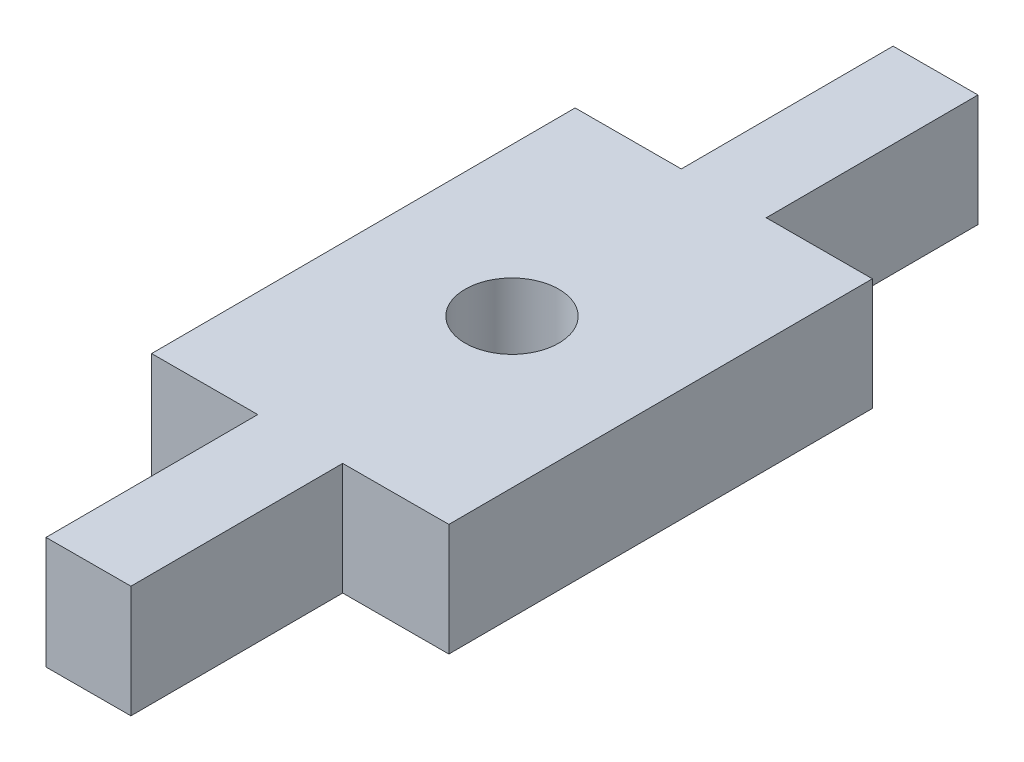
ISO-10303-21;
HEADER;
FILE_DESCRIPTION(('STEP AP214'),'2;1');
FILE_NAME('part.step','',(''),(''),'','','');
FILE_SCHEMA(('AUTOMOTIVE_DESIGN { 1 0 10303 214 1 1 1 1 }'));
ENDSEC;
DATA;
#1=APPLICATION_CONTEXT('core data for automotive mechanical design processes');
#2=APPLICATION_PROTOCOL_DEFINITION('international standard','automotive_design',2000,#1);
#3=PRODUCT_CONTEXT('',#1,'mechanical');
#4=PRODUCT('Part','Part','',(#3));
#5=PRODUCT_RELATED_PRODUCT_CATEGORY('part','',(#4));
#6=PRODUCT_DEFINITION_FORMATION('','',#4);
#7=PRODUCT_DEFINITION_CONTEXT('part definition',#1,'design');
#8=PRODUCT_DEFINITION('design','',#6,#7);
#9=PRODUCT_DEFINITION_SHAPE('','',#8);
#10=(LENGTH_UNIT() NAMED_UNIT(*) SI_UNIT(.MILLI.,.METRE.));
#11=(NAMED_UNIT(*) PLANE_ANGLE_UNIT() SI_UNIT($,.RADIAN.));
#12=(NAMED_UNIT(*) SI_UNIT($,.STERADIAN.) SOLID_ANGLE_UNIT());
#13=UNCERTAINTY_MEASURE_WITH_UNIT(LENGTH_MEASURE(1.E-05),#10,'distance_accuracy_value','');
#14=(GEOMETRIC_REPRESENTATION_CONTEXT(3) GLOBAL_UNCERTAINTY_ASSIGNED_CONTEXT((#13)) GLOBAL_UNIT_ASSIGNED_CONTEXT((#10,
#11,#12)) REPRESENTATION_CONTEXT('',''));
#15=CARTESIAN_POINT('',(0.,0.,0.));
#16=DIRECTION('',(0.,0.,1.));
#17=DIRECTION('',(1.,0.,0.));
#18=AXIS2_PLACEMENT_3D('',#15,#16,#17);
#19=CARTESIAN_POINT('',(0.,3.175,0.));
#20=DIRECTION('',(0.,1.,0.));
#21=DIRECTION('',(0.,0.,1.));
#22=AXIS2_PLACEMENT_3D('',#19,#20,#21);
#23=PLANE('',#22);
#24=DIRECTION('',(0.999997620052379,0.,-0.00218171711676331));
#25=VECTOR('',#24,1.);
#26=CARTESIAN_POINT('',(-4.1790587349807,3.175,6.009473219589));
#27=LINE('',#26,#25);
#28=CARTESIAN_POINT('',(-4.1790587349807,3.175,6.009473219589));
#29=VERTEX_POINT('',#28);
#30=CARTESIAN_POINT('',(-1.18433533863121,3.175,6.00293956474546));
#31=VERTEX_POINT('',#30);
#32=EDGE_CURVE('E177',#29,#31,#27,.T.);
#33=ORIENTED_EDGE('',*,*,#32,.T.);
#34=DIRECTION('',(0.0022355749233747,0.,0.999997501099259));
#35=VECTOR('',#34,1.);
#36=CARTESIAN_POINT('',(-1.18433533863121,3.175,6.00293956474546));
#37=LINE('',#36,#35);
#38=CARTESIAN_POINT('',(-1.17092121169299,3.175,12.003227578983));
#39=VERTEX_POINT('',#38);
#40=EDGE_CURVE('E105',#31,#39,#37,.T.);
#41=ORIENTED_EDGE('',*,*,#40,.T.);
#42=DIRECTION('',(0.999997366351428,0.,-0.00229505777875582));
#43=VECTOR('',#42,1.);
#44=CARTESIAN_POINT('',(-1.17092121169299,3.175,12.003227578983));
#45=LINE('',#44,#43);
#46=CARTESIAN_POINT('',(1.22484093270003,3.175,11.9977291519566));
#47=VERTEX_POINT('',#46);
#48=EDGE_CURVE('E204',#39,#47,#45,.T.);
#49=ORIENTED_EDGE('',*,*,#48,.T.);
#50=DIRECTION('',(-0.00225753018843583,0.,-0.999997451775477));
#51=VECTOR('',#50,1.);
#52=CARTESIAN_POINT('',(1.22484093270003,3.175,11.9977291519566));
#53=LINE('',#52,#51);
#54=CARTESIAN_POINT('',(1.21129519913732,3.175,5.99749973552108));
#55=VERTEX_POINT('',#54);
#56=EDGE_CURVE('E223',#47,#55,#53,.T.);
#57=ORIENTED_EDGE('',*,*,#56,.T.);
#58=DIRECTION('',(0.999997341998481,0.,-0.00230564437261143));
#59=VECTOR('',#58,1.);
#60=CARTESIAN_POINT('',(1.21129519913732,3.175,5.99749973552108));
#61=LINE('',#60,#59);
#62=CARTESIAN_POINT('',(4.20601372116491,3.175,5.99059496126031));
#63=VERTEX_POINT('',#62);
#64=EDGE_CURVE('E220',#55,#63,#61,.T.);
#65=ORIENTED_EDGE('',*,*,#64,.T.);
#66=DIRECTION('',(-0.00223602840674337,0.,-0.999997500085357));
#67=VECTOR('',#66,1.);
#68=CARTESIAN_POINT('',(4.20601372116491,3.175,5.99059496126031));
#69=LINE('',#68,#67);
#70=CARTESIAN_POINT('',(4.17918059296829,3.175,-6.00972714340131));
#71=VERTEX_POINT('',#70);
#72=EDGE_CURVE('E222',#63,#71,#69,.T.);
#73=ORIENTED_EDGE('',*,*,#72,.T.);
#74=DIRECTION('',(-0.999997482941177,0.,0.0022436825331287));
#75=VECTOR('',#74,1.);
#76=CARTESIAN_POINT('',(4.17918059296829,3.175,-6.00972714340131));
#77=LINE('',#76,#75);
#78=CARTESIAN_POINT('',(1.18446207094008,3.175,-6.00300792884914));
#79=VERTEX_POINT('',#78);
#80=EDGE_CURVE('E225',#71,#79,#77,.T.);
#81=ORIENTED_EDGE('',*,*,#80,.T.);
#82=DIRECTION('',(-0.00222503983464201,0.,-0.999997524595803));
#83=VECTOR('',#82,1.);
#84=CARTESIAN_POINT('',(1.18446207094008,3.175,-6.00300792884914));
#85=LINE('',#84,#83);
#86=CARTESIAN_POINT('',(1.17111131015341,3.175,-12.003227578983));
#87=VERTEX_POINT('',#86);
#88=EDGE_CURVE('E231',#79,#87,#85,.T.);
#89=ORIENTED_EDGE('',*,*,#88,.T.);
#90=DIRECTION('',(-0.999997421913954,0.,0.00227071914724054));
#91=VECTOR('',#90,1.);
#92=CARTESIAN_POINT('',(1.17111131015341,3.175,-12.003227578983));
#93=LINE('',#92,#91);
#94=CARTESIAN_POINT('',(-1.22452410193286,3.175,-11.9977877497587));
#95=VERTEX_POINT('',#94);
#96=EDGE_CURVE('E136',#87,#95,#93,.T.);
#97=ORIENTED_EDGE('',*,*,#96,.T.);
#98=DIRECTION('',(0.00223641274525618,0.,0.999997499225889));
#99=VECTOR('',#98,1.);
#100=CARTESIAN_POINT('',(-1.22452410193286,3.175,-11.9977877497587));
#101=LINE('',#100,#99);
#102=CARTESIAN_POINT('',(-1.21110510067507,3.175,-5.99756809962512));
#103=VERTEX_POINT('',#102);
#104=EDGE_CURVE('E130',#95,#103,#101,.T.);
#105=ORIENTED_EDGE('',*,*,#104,.T.);
#106=DIRECTION('',(-0.999997483260701,0.,0.00224354011872751));
#107=VECTOR('',#106,1.);
#108=CARTESIAN_POINT('',(-1.21110510067507,3.175,-5.99756809962512));
#109=LINE('',#108,#107);
#110=CARTESIAN_POINT('',(-4.20601372116486,3.175,-5.99084888507262));
#111=VERTEX_POINT('',#110);
#112=EDGE_CURVE('E134',#103,#111,#109,.T.);
#113=ORIENTED_EDGE('',*,*,#112,.T.);
#114=DIRECTION('',(0.00224618288996583,0.,0.99999747732803));
#115=VECTOR('',#114,1.);
#116=CARTESIAN_POINT('',(-4.20601372116486,3.175,-5.99084888507262));
#117=LINE('',#116,#115);
#118=EDGE_CURVE('E50',#111,#29,#117,.T.);
#119=ORIENTED_EDGE('',*,*,#118,.T.);
#120=EDGE_LOOP('',(#33,#41,#49,#57,#65,#73,#81,#89,#97,#105,#113,#119));
#121=FACE_BOUND('',#120,.T.);
#122=CARTESIAN_POINT('',(0.,3.175,0.));
#123=DIRECTION('',(0.,1.,0.));
#124=DIRECTION('',(0.,0.,1.));
#125=AXIS2_PLACEMENT_3D('',#122,#123,#124);
#126=CIRCLE('',#125,1.32368332768309);
#127=CARTESIAN_POINT('',(0.,3.175,1.32368332768309));
#128=VERTEX_POINT('',#127);
#129=EDGE_CURVE('E158',#128,#128,#126,.T.);
#130=ORIENTED_EDGE('',*,*,#129,.F.);
#131=EDGE_LOOP('',(#130));
#132=FACE_BOUND('',#131,.T.);
#133=ADVANCED_FACE('F33',(#121,#132),#23,.T.);
#134=CARTESIAN_POINT('',(0.,0.,0.));
#135=DIRECTION('',(0.,1.,0.));
#136=DIRECTION('',(0.,0.,1.));
#137=AXIS2_PLACEMENT_3D('',#134,#135,#136);
#138=PLANE('',#137);
#139=DIRECTION('',(0.999997620052379,0.,-0.00218171711676331));
#140=VECTOR('',#139,1.);
#141=CARTESIAN_POINT('',(-4.1790587349807,0.,6.009473219589));
#142=LINE('',#141,#140);
#143=CARTESIAN_POINT('',(-4.1790587349807,0.,6.009473219589));
#144=VERTEX_POINT('',#143);
#145=CARTESIAN_POINT('',(-1.18433533863121,0.,6.00293956474546));
#146=VERTEX_POINT('',#145);
#147=EDGE_CURVE('E154',#144,#146,#142,.T.);
#148=ORIENTED_EDGE('',*,*,#147,.F.);
#149=DIRECTION('',(0.00224618288996583,0.,0.99999747732803));
#150=VECTOR('',#149,1.);
#151=CARTESIAN_POINT('',(-4.20601372116486,0.,-5.99084888507262));
#152=LINE('',#151,#150);
#153=CARTESIAN_POINT('',(-4.20601372116486,0.,-5.99084888507262));
#154=VERTEX_POINT('',#153);
#155=EDGE_CURVE('E97',#154,#144,#152,.T.);
#156=ORIENTED_EDGE('',*,*,#155,.F.);
#157=DIRECTION('',(-0.999997483260701,0.,0.00224354011872751));
#158=VECTOR('',#157,1.);
#159=CARTESIAN_POINT('',(-1.21110510067507,0.,-5.99756809962512));
#160=LINE('',#159,#158);
#161=CARTESIAN_POINT('',(-1.21110510067507,0.,-5.99756809962512));
#162=VERTEX_POINT('',#161);
#163=EDGE_CURVE('E91',#162,#154,#160,.T.);
#164=ORIENTED_EDGE('',*,*,#163,.F.);
#165=DIRECTION('',(0.00223641274525618,0.,0.999997499225889));
#166=VECTOR('',#165,1.);
#167=CARTESIAN_POINT('',(-1.22452410193286,0.,-11.9977877497587));
#168=LINE('',#167,#166);
#169=CARTESIAN_POINT('',(-1.22452410193286,0.,-11.9977877497587));
#170=VERTEX_POINT('',#169);
#171=EDGE_CURVE('E144',#170,#162,#168,.T.);
#172=ORIENTED_EDGE('',*,*,#171,.F.);
#173=DIRECTION('',(-0.999997421913954,0.,0.00227071914724054));
#174=VECTOR('',#173,1.);
#175=CARTESIAN_POINT('',(1.17111131015341,0.,-12.003227578983));
#176=LINE('',#175,#174);
#177=CARTESIAN_POINT('',(1.17111131015341,0.,-12.003227578983));
#178=VERTEX_POINT('',#177);
#179=EDGE_CURVE('E172',#178,#170,#176,.T.);
#180=ORIENTED_EDGE('',*,*,#179,.F.);
#181=DIRECTION('',(-0.00222503983464201,0.,-0.999997524595803));
#182=VECTOR('',#181,1.);
#183=CARTESIAN_POINT('',(1.18446207094008,0.,-6.00300792884914));
#184=LINE('',#183,#182);
#185=CARTESIAN_POINT('',(1.18446207094008,0.,-6.00300792884914));
#186=VERTEX_POINT('',#185);
#187=EDGE_CURVE('E170',#186,#178,#184,.T.);
#188=ORIENTED_EDGE('',*,*,#187,.F.);
#189=DIRECTION('',(-0.999997482941177,0.,0.0022436825331287));
#190=VECTOR('',#189,1.);
#191=CARTESIAN_POINT('',(4.17918059296829,0.,-6.00972714340131));
#192=LINE('',#191,#190);
#193=CARTESIAN_POINT('',(4.17918059296829,0.,-6.00972714340131));
#194=VERTEX_POINT('',#193);
#195=EDGE_CURVE('E168',#194,#186,#192,.T.);
#196=ORIENTED_EDGE('',*,*,#195,.F.);
#197=DIRECTION('',(-0.00223602840674337,0.,-0.999997500085357));
#198=VECTOR('',#197,1.);
#199=CARTESIAN_POINT('',(4.20601372116491,0.,5.99059496126031));
#200=LINE('',#199,#198);
#201=CARTESIAN_POINT('',(4.20601372116491,0.,5.99059496126031));
#202=VERTEX_POINT('',#201);
#203=EDGE_CURVE('E166',#202,#194,#200,.T.);
#204=ORIENTED_EDGE('',*,*,#203,.F.);
#205=DIRECTION('',(0.999997341998481,0.,-0.00230564437261143));
#206=VECTOR('',#205,1.);
#207=CARTESIAN_POINT('',(1.21129519913732,0.,5.99749973552108));
#208=LINE('',#207,#206);
#209=CARTESIAN_POINT('',(1.21129519913732,0.,5.99749973552108));
#210=VERTEX_POINT('',#209);
#211=EDGE_CURVE('E164',#210,#202,#208,.T.);
#212=ORIENTED_EDGE('',*,*,#211,.F.);
#213=DIRECTION('',(-0.00225753018843583,0.,-0.999997451775477));
#214=VECTOR('',#213,1.);
#215=CARTESIAN_POINT('',(1.22484093270003,0.,11.9977291519566));
#216=LINE('',#215,#214);
#217=CARTESIAN_POINT('',(1.22484093270003,0.,11.9977291519566));
#218=VERTEX_POINT('',#217);
#219=EDGE_CURVE('E162',#218,#210,#216,.T.);
#220=ORIENTED_EDGE('',*,*,#219,.F.);
#221=DIRECTION('',(0.999997366351428,0.,-0.00229505777875582));
#222=VECTOR('',#221,1.);
#223=CARTESIAN_POINT('',(-1.17092121169299,0.,12.003227578983));
#224=LINE('',#223,#222);
#225=CARTESIAN_POINT('',(-1.17092121169299,0.,12.003227578983));
#226=VERTEX_POINT('',#225);
#227=EDGE_CURVE('E160',#226,#218,#224,.T.);
#228=ORIENTED_EDGE('',*,*,#227,.F.);
#229=DIRECTION('',(0.0022355749233747,0.,0.999997501099259));
#230=VECTOR('',#229,1.);
#231=CARTESIAN_POINT('',(-1.18433533863121,0.,6.00293956474546));
#232=LINE('',#231,#230);
#233=EDGE_CURVE('E157',#146,#226,#232,.T.);
#234=ORIENTED_EDGE('',*,*,#233,.F.);
#235=EDGE_LOOP('',(#148,#156,#164,#172,#180,#188,#196,#204,#212,#220,#228,#234));
#236=FACE_BOUND('',#235,.T.);
#237=CARTESIAN_POINT('',(0.,0.,0.));
#238=DIRECTION('',(0.,1.,0.));
#239=DIRECTION('',(0.,0.,1.));
#240=AXIS2_PLACEMENT_3D('',#237,#238,#239);
#241=CIRCLE('',#240,1.32368332768309);
#242=CARTESIAN_POINT('',(0.,0.,1.32368332768309));
#243=VERTEX_POINT('',#242);
#244=EDGE_CURVE('E378',#243,#243,#241,.T.);
#245=ORIENTED_EDGE('',*,*,#244,.T.);
#246=EDGE_LOOP('',(#245));
#247=FACE_BOUND('',#246,.T.);
#248=ADVANCED_FACE('F208',(#236,#247),#138,.F.);
#249=CARTESIAN_POINT('',(-4.1790587349807,3.175,6.009473219589));
#250=DIRECTION('',(-0.00218171711676331,0.,-0.999997620052379));
#251=DIRECTION('',(-0.999997620052379,0.,0.00218171711676331));
#252=AXIS2_PLACEMENT_3D('',#249,#250,#251);
#253=PLANE('',#252);
#254=ORIENTED_EDGE('',*,*,#147,.T.);
#255=DIRECTION('',(0.,-1.,0.));
#256=VECTOR('',#255,1.);
#257=CARTESIAN_POINT('',(-1.18433533863121,3.175,6.00293956474546));
#258=LINE('',#257,#256);
#259=EDGE_CURVE('E11',#31,#146,#258,.T.);
#260=ORIENTED_EDGE('',*,*,#259,.F.);
#261=ORIENTED_EDGE('',*,*,#32,.F.);
#262=DIRECTION('',(0.,-1.,0.));
#263=VECTOR('',#262,1.);
#264=CARTESIAN_POINT('',(-4.1790587349807,3.175,6.009473219589));
#265=LINE('',#264,#263);
#266=EDGE_CURVE('E150',#29,#144,#265,.T.);
#267=ORIENTED_EDGE('',*,*,#266,.T.);
#268=EDGE_LOOP('',(#254,#260,#261,#267));
#269=FACE_BOUND('',#268,.T.);
#270=ADVANCED_FACE('F35',(#269),#253,.F.);
#271=CARTESIAN_POINT('',(-1.18433533863121,3.175,6.00293956474546));
#272=DIRECTION('',(0.999997501099259,0.,-0.0022355749233747));
#273=DIRECTION('',(-0.0022355749233747,0.,-0.999997501099259));
#274=AXIS2_PLACEMENT_3D('',#271,#272,#273);
#275=PLANE('',#274);
#276=ORIENTED_EDGE('',*,*,#233,.T.);
#277=DIRECTION('',(0.,-1.,0.));
#278=VECTOR('',#277,1.);
#279=CARTESIAN_POINT('',(-1.17092121169299,3.175,12.003227578983));
#280=LINE('',#279,#278);
#281=EDGE_CURVE('E42',#39,#226,#280,.T.);
#282=ORIENTED_EDGE('',*,*,#281,.F.);
#283=ORIENTED_EDGE('',*,*,#40,.F.);
#284=ORIENTED_EDGE('',*,*,#259,.T.);
#285=EDGE_LOOP('',(#276,#282,#283,#284));
#286=FACE_BOUND('',#285,.T.);
#287=ADVANCED_FACE('F265',(#286),#275,.F.);
#288=CARTESIAN_POINT('',(-1.17092121169299,3.175,12.003227578983));
#289=DIRECTION('',(-0.00229505777875582,0.,-0.999997366351428));
#290=DIRECTION('',(-0.999997366351428,0.,0.00229505777875582));
#291=AXIS2_PLACEMENT_3D('',#288,#289,#290);
#292=PLANE('',#291);
#293=ORIENTED_EDGE('',*,*,#227,.T.);
#294=DIRECTION('',(0.,-1.,0.));
#295=VECTOR('',#294,1.);
#296=CARTESIAN_POINT('',(1.22484093270003,3.175,11.9977291519566));
#297=LINE('',#296,#295);
#298=EDGE_CURVE('E196',#47,#218,#297,.T.);
#299=ORIENTED_EDGE('',*,*,#298,.F.);
#300=ORIENTED_EDGE('',*,*,#48,.F.);
#301=ORIENTED_EDGE('',*,*,#281,.T.);
#302=EDGE_LOOP('',(#293,#299,#300,#301));
#303=FACE_BOUND('',#302,.T.);
#304=ADVANCED_FACE('F202',(#303),#292,.F.);
#305=CARTESIAN_POINT('',(1.22484093270003,3.175,11.9977291519566));
#306=DIRECTION('',(-0.999997451775477,0.,0.00225753018843583));
#307=DIRECTION('',(0.00225753018843583,0.,0.999997451775477));
#308=AXIS2_PLACEMENT_3D('',#305,#306,#307);
#309=PLANE('',#308);
#310=ORIENTED_EDGE('',*,*,#219,.T.);
#311=DIRECTION('',(0.,-1.,0.));
#312=VECTOR('',#311,1.);
#313=CARTESIAN_POINT('',(1.21129519913732,3.175,5.99749973552108));
#314=LINE('',#313,#312);
#315=EDGE_CURVE('E193',#55,#210,#314,.T.);
#316=ORIENTED_EDGE('',*,*,#315,.F.);
#317=ORIENTED_EDGE('',*,*,#56,.F.);
#318=ORIENTED_EDGE('',*,*,#298,.T.);
#319=EDGE_LOOP('',(#310,#316,#317,#318));
#320=FACE_BOUND('',#319,.T.);
#321=ADVANCED_FACE('F214',(#320),#309,.F.);
#322=CARTESIAN_POINT('',(1.21129519913732,3.175,5.99749973552108));
#323=DIRECTION('',(-0.00230564437261144,0.,-0.999997341998481));
#324=DIRECTION('',(-0.999997341998481,0.,0.00230564437261144));
#325=AXIS2_PLACEMENT_3D('',#322,#323,#324);
#326=PLANE('',#325);
#327=ORIENTED_EDGE('',*,*,#211,.T.);
#328=DIRECTION('',(0.,-1.,0.));
#329=VECTOR('',#328,1.);
#330=CARTESIAN_POINT('',(4.20601372116491,3.175,5.99059496126031));
#331=LINE('',#330,#329);
#332=EDGE_CURVE('E190',#63,#202,#331,.T.);
#333=ORIENTED_EDGE('',*,*,#332,.F.);
#334=ORIENTED_EDGE('',*,*,#64,.F.);
#335=ORIENTED_EDGE('',*,*,#315,.T.);
#336=EDGE_LOOP('',(#327,#333,#334,#335));
#337=FACE_BOUND('',#336,.T.);
#338=ADVANCED_FACE('F218',(#337),#326,.F.);
#339=CARTESIAN_POINT('',(4.20601372116491,3.175,5.99059496126031));
#340=DIRECTION('',(-0.999997500085357,0.,0.00223602840674337));
#341=DIRECTION('',(0.00223602840674337,0.,0.999997500085357));
#342=AXIS2_PLACEMENT_3D('',#339,#340,#341);
#343=PLANE('',#342);
#344=ORIENTED_EDGE('',*,*,#203,.T.);
#345=DIRECTION('',(0.,-1.,0.));
#346=VECTOR('',#345,1.);
#347=CARTESIAN_POINT('',(4.17918059296829,3.175,-6.00972714340131));
#348=LINE('',#347,#346);
#349=EDGE_CURVE('E187',#71,#194,#348,.T.);
#350=ORIENTED_EDGE('',*,*,#349,.F.);
#351=ORIENTED_EDGE('',*,*,#72,.F.);
#352=ORIENTED_EDGE('',*,*,#332,.T.);
#353=EDGE_LOOP('',(#344,#350,#351,#352));
#354=FACE_BOUND('',#353,.T.);
#355=ADVANCED_FACE('F278',(#354),#343,.F.);
#356=CARTESIAN_POINT('',(4.17918059296829,3.175,-6.00972714340131));
#357=DIRECTION('',(0.0022436825331287,0.,0.999997482941178));
#358=DIRECTION('',(0.999997482941178,0.,-0.0022436825331287));
#359=AXIS2_PLACEMENT_3D('',#356,#357,#358);
#360=PLANE('',#359);
#361=ORIENTED_EDGE('',*,*,#195,.T.);
#362=DIRECTION('',(0.,-1.,0.));
#363=VECTOR('',#362,1.);
#364=CARTESIAN_POINT('',(1.18446207094008,3.175,-6.00300792884914));
#365=LINE('',#364,#363);
#366=EDGE_CURVE('E184',#79,#186,#365,.T.);
#367=ORIENTED_EDGE('',*,*,#366,.F.);
#368=ORIENTED_EDGE('',*,*,#80,.F.);
#369=ORIENTED_EDGE('',*,*,#349,.T.);
#370=EDGE_LOOP('',(#361,#367,#368,#369));
#371=FACE_BOUND('',#370,.T.);
#372=ADVANCED_FACE('F281',(#371),#360,.F.);
#373=CARTESIAN_POINT('',(1.18446207094008,3.175,-6.00300792884914));
#374=DIRECTION('',(-0.999997524595803,0.,0.00222503983464201));
#375=DIRECTION('',(0.00222503983464201,0.,0.999997524595803));
#376=AXIS2_PLACEMENT_3D('',#373,#374,#375);
#377=PLANE('',#376);
#378=ORIENTED_EDGE('',*,*,#187,.T.);
#379=DIRECTION('',(0.,-1.,0.));
#380=VECTOR('',#379,1.);
#381=CARTESIAN_POINT('',(1.17111131015341,3.175,-12.003227578983));
#382=LINE('',#381,#380);
#383=EDGE_CURVE('E181',#87,#178,#382,.T.);
#384=ORIENTED_EDGE('',*,*,#383,.F.);
#385=ORIENTED_EDGE('',*,*,#88,.F.);
#386=ORIENTED_EDGE('',*,*,#366,.T.);
#387=EDGE_LOOP('',(#378,#384,#385,#386));
#388=FACE_BOUND('',#387,.T.);
#389=ADVANCED_FACE('F237',(#388),#377,.F.);
#390=CARTESIAN_POINT('',(1.17111131015341,3.175,-12.003227578983));
#391=DIRECTION('',(0.00227071914724054,0.,0.999997421913954));
#392=DIRECTION('',(0.999997421913954,0.,-0.00227071914724054));
#393=AXIS2_PLACEMENT_3D('',#390,#391,#392);
#394=PLANE('',#393);
#395=ORIENTED_EDGE('',*,*,#179,.T.);
#396=DIRECTION('',(0.,-1.,0.));
#397=VECTOR('',#396,1.);
#398=CARTESIAN_POINT('',(-1.22452410193286,3.175,-11.9977877497587));
#399=LINE('',#398,#397);
#400=EDGE_CURVE('E145',#95,#170,#399,.T.);
#401=ORIENTED_EDGE('',*,*,#400,.F.);
#402=ORIENTED_EDGE('',*,*,#96,.F.);
#403=ORIENTED_EDGE('',*,*,#383,.T.);
#404=EDGE_LOOP('',(#395,#401,#402,#403));
#405=FACE_BOUND('',#404,.T.);
#406=ADVANCED_FACE('F241',(#405),#394,.F.);
#407=CARTESIAN_POINT('',(-1.22452410193286,3.175,-11.9977877497587));
#408=DIRECTION('',(0.99999749922589,0.,-0.00223641274525619));
#409=DIRECTION('',(-0.00223641274525618,0.,-0.999997499225889));
#410=AXIS2_PLACEMENT_3D('',#407,#408,#409);
#411=PLANE('',#410);
#412=ORIENTED_EDGE('',*,*,#171,.T.);
#413=DIRECTION('',(0.,-1.,0.));
#414=VECTOR('',#413,1.);
#415=CARTESIAN_POINT('',(-1.21110510067507,3.175,-5.99756809962512));
#416=LINE('',#415,#414);
#417=EDGE_CURVE('E141',#103,#162,#416,.T.);
#418=ORIENTED_EDGE('',*,*,#417,.F.);
#419=ORIENTED_EDGE('',*,*,#104,.F.);
#420=ORIENTED_EDGE('',*,*,#400,.T.);
#421=EDGE_LOOP('',(#412,#418,#419,#420));
#422=FACE_BOUND('',#421,.T.);
#423=ADVANCED_FACE('F142',(#422),#411,.F.);
#424=CARTESIAN_POINT('',(-1.21110510067507,3.175,-5.99756809962512));
#425=DIRECTION('',(0.00224354011872751,0.,0.999997483260701));
#426=DIRECTION('',(0.999997483260701,0.,-0.00224354011872751));
#427=AXIS2_PLACEMENT_3D('',#424,#425,#426);
#428=PLANE('',#427);
#429=ORIENTED_EDGE('',*,*,#163,.T.);
#430=DIRECTION('',(0.,-1.,0.));
#431=VECTOR('',#430,1.);
#432=CARTESIAN_POINT('',(-4.20601372116486,3.175,-5.99084888507262));
#433=LINE('',#432,#431);
#434=EDGE_CURVE('E146',#111,#154,#433,.T.);
#435=ORIENTED_EDGE('',*,*,#434,.F.);
#436=ORIENTED_EDGE('',*,*,#112,.F.);
#437=ORIENTED_EDGE('',*,*,#417,.T.);
#438=EDGE_LOOP('',(#429,#435,#436,#437));
#439=FACE_BOUND('',#438,.T.);
#440=ADVANCED_FACE('F148',(#439),#428,.F.);
#441=CARTESIAN_POINT('',(-4.20601372116486,3.175,-5.99084888507262));
#442=DIRECTION('',(0.99999747732803,0.,-0.00224618288996583));
#443=DIRECTION('',(-0.00224618288996583,0.,-0.99999747732803));
#444=AXIS2_PLACEMENT_3D('',#441,#442,#443);
#445=PLANE('',#444);
#446=ORIENTED_EDGE('',*,*,#155,.T.);
#447=ORIENTED_EDGE('',*,*,#266,.F.);
#448=ORIENTED_EDGE('',*,*,#118,.F.);
#449=ORIENTED_EDGE('',*,*,#434,.T.);
#450=EDGE_LOOP('',(#446,#447,#448,#449));
#451=FACE_BOUND('',#450,.T.);
#452=ADVANCED_FACE('F245',(#451),#445,.F.);
#453=CARTESIAN_POINT('',(0.,3.175,0.));
#454=DIRECTION('',(0.,-1.,0.));
#455=DIRECTION('',(0.,0.,-1.));
#456=AXIS2_PLACEMENT_3D('',#453,#454,#455);
#457=CYLINDRICAL_SURFACE('',#456,1.32368332768309);
#458=ORIENTED_EDGE('',*,*,#129,.T.);
#459=EDGE_LOOP('',(#458));
#460=FACE_BOUND('',#459,.T.);
#461=ORIENTED_EDGE('',*,*,#244,.F.);
#462=EDGE_LOOP('',(#461));
#463=FACE_BOUND('',#462,.T.);
#464=ADVANCED_FACE('F247',(#460,#463),#457,.F.);
#465=CLOSED_SHELL('',(#133,#248,#270,#287,#304,#321,#338,#355,#372,#389,#406,#423,#440,#452,#464));
#466=MANIFOLD_SOLID_BREP('B2',#465);
#467=ADVANCED_BREP_SHAPE_REPRESENTATION('',(#18,#466),#14);
#468=SHAPE_DEFINITION_REPRESENTATION(#9,#467);
ENDSEC;
END-ISO-10303-21;
